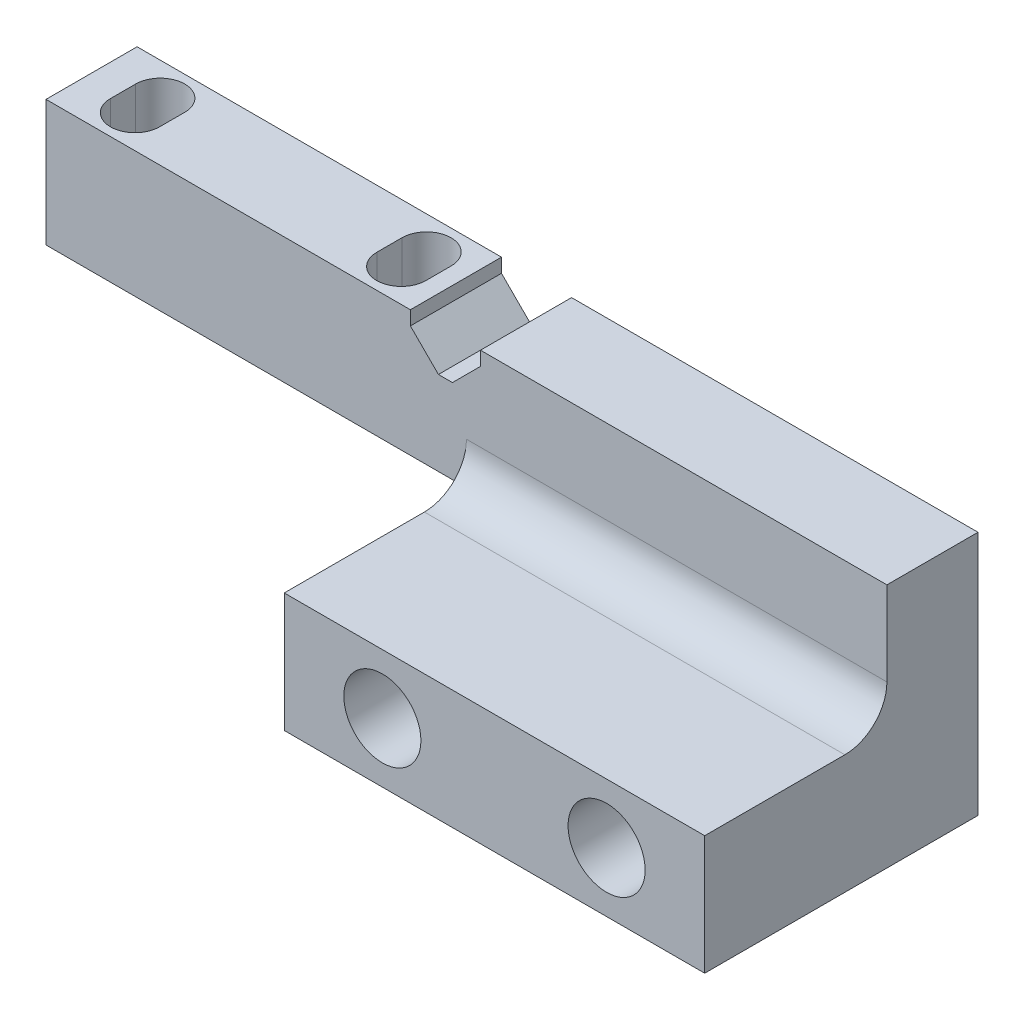
ISO-10303-21;
HEADER;
FILE_DESCRIPTION(('STEP AP214'),'2;1');
FILE_NAME('part.step','',(''),(''),'','','');
FILE_SCHEMA(('AUTOMOTIVE_DESIGN { 1 0 10303 214 1 1 1 1 }'));
ENDSEC;
DATA;
#1=APPLICATION_CONTEXT('core data for automotive mechanical design processes');
#2=APPLICATION_PROTOCOL_DEFINITION('international standard','automotive_design',2000,#1);
#3=PRODUCT_CONTEXT('',#1,'mechanical');
#4=PRODUCT('Part','Part','',(#3));
#5=PRODUCT_RELATED_PRODUCT_CATEGORY('part','',(#4));
#6=PRODUCT_DEFINITION_FORMATION('','',#4);
#7=PRODUCT_DEFINITION_CONTEXT('part definition',#1,'design');
#8=PRODUCT_DEFINITION('design','',#6,#7);
#9=PRODUCT_DEFINITION_SHAPE('','',#8);
#10=(LENGTH_UNIT() NAMED_UNIT(*) SI_UNIT(.MILLI.,.METRE.));
#11=(NAMED_UNIT(*) PLANE_ANGLE_UNIT() SI_UNIT($,.RADIAN.));
#12=(NAMED_UNIT(*) SI_UNIT($,.STERADIAN.) SOLID_ANGLE_UNIT());
#13=UNCERTAINTY_MEASURE_WITH_UNIT(LENGTH_MEASURE(1.E-05),#10,'distance_accuracy_value','');
#14=(GEOMETRIC_REPRESENTATION_CONTEXT(3) GLOBAL_UNCERTAINTY_ASSIGNED_CONTEXT((#13)) GLOBAL_UNIT_ASSIGNED_CONTEXT((#10,
#11,#12)) REPRESENTATION_CONTEXT('',''));
#15=CARTESIAN_POINT('',(0.,0.,0.));
#16=DIRECTION('',(0.,0.,1.));
#17=DIRECTION('',(1.,0.,0.));
#18=AXIS2_PLACEMENT_3D('',#15,#16,#17);
#19=CARTESIAN_POINT('',(-50.,13.25,0.));
#20=DIRECTION('',(0.,1.,0.));
#21=DIRECTION('',(1.,0.,0.));
#22=AXIS2_PLACEMENT_3D('',#19,#20,#21);
#23=PLANE('',#22);
#24=DIRECTION('',(0.,0.,-1.));
#25=VECTOR('',#24,1.);
#26=CARTESIAN_POINT('',(-69.,13.25,0.));
#27=LINE('',#26,#25);
#28=CARTESIAN_POINT('',(-69.,13.25,6.5));
#29=VERTEX_POINT('',#28);
#30=CARTESIAN_POINT('',(-69.,13.25,0.));
#31=VERTEX_POINT('',#30);
#32=EDGE_CURVE('E192',#29,#31,#27,.T.);
#33=ORIENTED_EDGE('',*,*,#32,.T.);
#34=DIRECTION('',(1.,0.,0.));
#35=VECTOR('',#34,1.);
#36=CARTESIAN_POINT('',(-5.,13.25,0.));
#37=LINE('',#36,#35);
#38=CARTESIAN_POINT('',(-95.,13.25,0.));
#39=VERTEX_POINT('',#38);
#40=EDGE_CURVE('E201',#39,#31,#37,.T.);
#41=ORIENTED_EDGE('',*,*,#40,.F.);
#42=DIRECTION('',(0.,0.,1.));
#43=VECTOR('',#42,1.);
#44=CARTESIAN_POINT('',(-95.,13.25,0.));
#45=LINE('',#44,#43);
#46=CARTESIAN_POINT('',(-95.,13.25,6.5));
#47=VERTEX_POINT('',#46);
#48=EDGE_CURVE('E276',#39,#47,#45,.T.);
#49=ORIENTED_EDGE('',*,*,#48,.T.);
#50=DIRECTION('',(-1.,0.,0.));
#51=VECTOR('',#50,1.);
#52=CARTESIAN_POINT('',(-5.,13.25,6.5));
#53=LINE('',#52,#51);
#54=EDGE_CURVE('E216',#29,#47,#53,.T.);
#55=ORIENTED_EDGE('',*,*,#54,.F.);
#56=EDGE_LOOP('',(#33,#41,#49,#55));
#57=FACE_BOUND('',#56,.T.);
#58=CARTESIAN_POINT('',(-72.,13.25,2.35));
#59=DIRECTION('',(0.,-1.,0.));
#60=DIRECTION('',(1.,0.,0.));
#61=AXIS2_PLACEMENT_3D('',#58,#59,#60);
#62=CIRCLE('',#61,1.75);
#63=CARTESIAN_POINT('',(-73.75,13.25,2.35));
#64=VERTEX_POINT('',#63);
#65=CARTESIAN_POINT('',(-70.25,13.25,2.35));
#66=VERTEX_POINT('',#65);
#67=EDGE_CURVE('E235',#64,#66,#62,.T.);
#68=ORIENTED_EDGE('',*,*,#67,.T.);
#69=DIRECTION('',(0.,0.,1.));
#70=VECTOR('',#69,1.);
#71=CARTESIAN_POINT('',(-70.25,13.25,2.35));
#72=LINE('',#71,#70);
#73=CARTESIAN_POINT('',(-70.25,13.25,4.15));
#74=VERTEX_POINT('',#73);
#75=EDGE_CURVE('E238',#66,#74,#72,.T.);
#76=ORIENTED_EDGE('',*,*,#75,.T.);
#77=CARTESIAN_POINT('',(-72.,13.25,4.15));
#78=DIRECTION('',(0.,-1.,0.));
#79=DIRECTION('',(1.,0.,0.));
#80=AXIS2_PLACEMENT_3D('',#77,#78,#79);
#81=CIRCLE('',#80,1.75);
#82=CARTESIAN_POINT('',(-73.75,13.25,4.15));
#83=VERTEX_POINT('',#82);
#84=EDGE_CURVE('E241',#74,#83,#81,.T.);
#85=ORIENTED_EDGE('',*,*,#84,.T.);
#86=DIRECTION('',(0.,0.,-1.));
#87=VECTOR('',#86,1.);
#88=CARTESIAN_POINT('',(-73.75,13.25,2.35));
#89=LINE('',#88,#87);
#90=EDGE_CURVE('E244',#83,#64,#89,.T.);
#91=ORIENTED_EDGE('',*,*,#90,.T.);
#92=EDGE_LOOP('',(#68,#76,#85,#91));
#93=FACE_BOUND('',#92,.T.);
#94=DIRECTION('',(0.,0.,-1.));
#95=VECTOR('',#94,1.);
#96=CARTESIAN_POINT('',(-89.25,13.25,2.35));
#97=LINE('',#96,#95);
#98=CARTESIAN_POINT('',(-89.25,13.25,4.15));
#99=VERTEX_POINT('',#98);
#100=CARTESIAN_POINT('',(-89.25,13.25,2.35));
#101=VERTEX_POINT('',#100);
#102=EDGE_CURVE('E258',#99,#101,#97,.T.);
#103=ORIENTED_EDGE('',*,*,#102,.F.);
#104=CARTESIAN_POINT('',(-91.,13.25,4.15));
#105=DIRECTION('',(0.,1.,0.));
#106=DIRECTION('',(-1.,0.,0.));
#107=AXIS2_PLACEMENT_3D('',#104,#105,#106);
#108=CIRCLE('',#107,1.75);
#109=CARTESIAN_POINT('',(-92.75,13.25,4.15));
#110=VERTEX_POINT('',#109);
#111=EDGE_CURVE('E261',#110,#99,#108,.T.);
#112=ORIENTED_EDGE('',*,*,#111,.F.);
#113=DIRECTION('',(0.,0.,1.));
#114=VECTOR('',#113,1.);
#115=CARTESIAN_POINT('',(-92.75,13.25,2.35));
#116=LINE('',#115,#114);
#117=CARTESIAN_POINT('',(-92.75,13.25,2.35));
#118=VERTEX_POINT('',#117);
#119=EDGE_CURVE('E264',#118,#110,#116,.T.);
#120=ORIENTED_EDGE('',*,*,#119,.F.);
#121=CARTESIAN_POINT('',(-91.,13.25,2.35));
#122=DIRECTION('',(0.,1.,0.));
#123=DIRECTION('',(-1.,0.,0.));
#124=AXIS2_PLACEMENT_3D('',#121,#122,#123);
#125=CIRCLE('',#124,1.75);
#126=EDGE_CURVE('E250',#101,#118,#125,.T.);
#127=ORIENTED_EDGE('',*,*,#126,.F.);
#128=EDGE_LOOP('',(#103,#112,#120,#127));
#129=FACE_BOUND('',#128,.T.);
#130=ADVANCED_FACE('F35',(#57,#93,#129),#23,.T.);
#131=DIRECTION('',(0.,0.,1.));
#132=VECTOR('',#131,1.);
#133=CARTESIAN_POINT('',(-64.,13.25,0.));
#134=LINE('',#133,#132);
#135=CARTESIAN_POINT('',(-64.,13.25,0.));
#136=VERTEX_POINT('',#135);
#137=CARTESIAN_POINT('',(-64.,13.25,6.5));
#138=VERTEX_POINT('',#137);
#139=EDGE_CURVE('E217',#136,#138,#134,.T.);
#140=ORIENTED_EDGE('',*,*,#139,.T.);
#141=CARTESIAN_POINT('',(-35.,13.25,6.5));
#142=VERTEX_POINT('',#141);
#143=EDGE_CURVE('E308',#142,#138,#53,.T.);
#144=ORIENTED_EDGE('',*,*,#143,.F.);
#145=DIRECTION('',(0.,0.,1.));
#146=VECTOR('',#145,1.);
#147=CARTESIAN_POINT('',(-35.,13.25,-3.5));
#148=LINE('',#147,#146);
#149=CARTESIAN_POINT('',(-35.,13.25,0.));
#150=VERTEX_POINT('',#149);
#151=EDGE_CURVE('E232',#150,#142,#148,.T.);
#152=ORIENTED_EDGE('',*,*,#151,.F.);
#153=EDGE_CURVE('E211',#136,#150,#37,.T.);
#154=ORIENTED_EDGE('',*,*,#153,.F.);
#155=EDGE_LOOP('',(#140,#144,#152,#154));
#156=FACE_BOUND('',#155,.T.);
#157=ADVANCED_FACE('F394',(#156),#23,.T.);
#158=CARTESIAN_POINT('',(-50.,4.25000000000001,0.));
#159=DIRECTION('',(0.,1.,0.));
#160=DIRECTION('',(-1.,0.,0.));
#161=AXIS2_PLACEMENT_3D('',#158,#159,#160);
#162=PLANE('',#161);
#163=DIRECTION('',(0.,0.,-1.));
#164=VECTOR('',#163,1.);
#165=CARTESIAN_POINT('',(-73.75,4.25000000000002,0.));
#166=LINE('',#165,#164);
#167=CARTESIAN_POINT('',(-73.75,4.25000000000002,4.15));
#168=VERTEX_POINT('',#167);
#169=CARTESIAN_POINT('',(-73.75,4.25000000000002,2.35));
#170=VERTEX_POINT('',#169);
#171=EDGE_CURVE('E366',#168,#170,#166,.T.);
#172=ORIENTED_EDGE('',*,*,#171,.F.);
#173=CARTESIAN_POINT('',(-72.,4.25000000000002,4.15));
#174=DIRECTION('',(0.,-1.,0.));
#175=DIRECTION('',(1.,0.,0.));
#176=AXIS2_PLACEMENT_3D('',#173,#174,#175);
#177=CIRCLE('',#176,1.75);
#178=CARTESIAN_POINT('',(-70.25,4.25000000000002,4.15));
#179=VERTEX_POINT('',#178);
#180=EDGE_CURVE('E363',#179,#168,#177,.T.);
#181=ORIENTED_EDGE('',*,*,#180,.F.);
#182=DIRECTION('',(0.,0.,1.));
#183=VECTOR('',#182,1.);
#184=CARTESIAN_POINT('',(-70.25,4.25000000000002,0.));
#185=LINE('',#184,#183);
#186=CARTESIAN_POINT('',(-70.25,4.25000000000002,2.35));
#187=VERTEX_POINT('',#186);
#188=EDGE_CURVE('E360',#187,#179,#185,.T.);
#189=ORIENTED_EDGE('',*,*,#188,.F.);
#190=CARTESIAN_POINT('',(-72.,4.25000000000002,2.35));
#191=DIRECTION('',(0.,-1.,0.));
#192=DIRECTION('',(1.,0.,0.));
#193=AXIS2_PLACEMENT_3D('',#190,#191,#192);
#194=CIRCLE('',#193,1.75);
#195=EDGE_CURVE('E369',#170,#187,#194,.T.);
#196=ORIENTED_EDGE('',*,*,#195,.F.);
#197=EDGE_LOOP('',(#172,#181,#189,#196));
#198=FACE_BOUND('',#197,.T.);
#199=DIRECTION('',(1.,0.,0.));
#200=VECTOR('',#199,1.);
#201=CARTESIAN_POINT('',(-95.,4.25000000000003,6.5));
#202=LINE('',#201,#200);
#203=CARTESIAN_POINT('',(-95.,4.25000000000003,6.5));
#204=VERTEX_POINT('',#203);
#205=CARTESIAN_POINT('',(-65.,4.25000000000002,6.5));
#206=VERTEX_POINT('',#205);
#207=EDGE_CURVE('E279',#204,#206,#202,.T.);
#208=ORIENTED_EDGE('',*,*,#207,.F.);
#209=DIRECTION('',(0.,0.,1.));
#210=VECTOR('',#209,1.);
#211=CARTESIAN_POINT('',(-95.,4.25000000000003,0.));
#212=LINE('',#211,#210);
#213=CARTESIAN_POINT('',(-95.,4.25000000000003,0.));
#214=VERTEX_POINT('',#213);
#215=EDGE_CURVE('E270',#214,#204,#212,.T.);
#216=ORIENTED_EDGE('',*,*,#215,.F.);
#217=DIRECTION('',(-1.,0.,0.));
#218=VECTOR('',#217,1.);
#219=CARTESIAN_POINT('',(-95.,4.25000000000003,0.));
#220=LINE('',#219,#218);
#221=CARTESIAN_POINT('',(-65.,4.25000000000002,0.));
#222=VERTEX_POINT('',#221);
#223=EDGE_CURVE('E282',#222,#214,#220,.T.);
#224=ORIENTED_EDGE('',*,*,#223,.F.);
#225=DIRECTION('',(0.,0.,-1.));
#226=VECTOR('',#225,1.);
#227=CARTESIAN_POINT('',(-65.,4.25000000000002,25.));
#228=LINE('',#227,#226);
#229=EDGE_CURVE('E291',#206,#222,#228,.T.);
#230=ORIENTED_EDGE('',*,*,#229,.F.);
#231=EDGE_LOOP('',(#208,#216,#224,#230));
#232=FACE_BOUND('',#231,.T.);
#233=CARTESIAN_POINT('',(-91.,4.25000000000003,2.35));
#234=DIRECTION('',(0.,-1.,0.));
#235=DIRECTION('',(1.,0.,0.));
#236=AXIS2_PLACEMENT_3D('',#233,#234,#235);
#237=CIRCLE('',#236,1.75);
#238=CARTESIAN_POINT('',(-89.25,4.25000000000003,2.35));
#239=VERTEX_POINT('',#238);
#240=CARTESIAN_POINT('',(-92.75,4.25000000000003,2.35));
#241=VERTEX_POINT('',#240);
#242=EDGE_CURVE('E357',#239,#241,#237,.F.);
#243=ORIENTED_EDGE('',*,*,#242,.T.);
#244=DIRECTION('',(0.,0.,1.));
#245=VECTOR('',#244,1.);
#246=CARTESIAN_POINT('',(-92.75,4.25000000000003,0.));
#247=LINE('',#246,#245);
#248=CARTESIAN_POINT('',(-92.75,4.25000000000003,4.15));
#249=VERTEX_POINT('',#248);
#250=EDGE_CURVE('E354',#241,#249,#247,.T.);
#251=ORIENTED_EDGE('',*,*,#250,.T.);
#252=CARTESIAN_POINT('',(-91.,4.25000000000003,4.15));
#253=DIRECTION('',(0.,-1.,0.));
#254=DIRECTION('',(1.,0.,0.));
#255=AXIS2_PLACEMENT_3D('',#252,#253,#254);
#256=CIRCLE('',#255,1.75);
#257=CARTESIAN_POINT('',(-89.25,4.25000000000003,4.15));
#258=VERTEX_POINT('',#257);
#259=EDGE_CURVE('E351',#249,#258,#256,.F.);
#260=ORIENTED_EDGE('',*,*,#259,.T.);
#261=DIRECTION('',(0.,0.,-1.));
#262=VECTOR('',#261,1.);
#263=CARTESIAN_POINT('',(-89.25,4.25000000000003,0.));
#264=LINE('',#263,#262);
#265=EDGE_CURVE('E346',#258,#239,#264,.T.);
#266=ORIENTED_EDGE('',*,*,#265,.T.);
#267=EDGE_LOOP('',(#243,#251,#260,#266));
#268=FACE_BOUND('',#267,.T.);
#269=ADVANCED_FACE('F410',(#198,#232,#268),#162,.F.);
#270=CARTESIAN_POINT('',(-65.,4.25000000000002,25.));
#271=DIRECTION('',(0.,-1.,0.));
#272=DIRECTION('',(-1.,0.,0.));
#273=AXIS2_PLACEMENT_3D('',#270,#271,#272);
#274=PLANE('',#273);
#275=DIRECTION('',(0.,0.,-1.));
#276=VECTOR('',#275,1.);
#277=CARTESIAN_POINT('',(-35.,4.25,25.));
#278=LINE('',#277,#276);
#279=CARTESIAN_POINT('',(-35.,4.25000000000001,19.5));
#280=VERTEX_POINT('',#279);
#281=CARTESIAN_POINT('',(-35.,4.25,9.5));
#282=VERTEX_POINT('',#281);
#283=EDGE_CURVE('E324',#280,#282,#278,.T.);
#284=ORIENTED_EDGE('',*,*,#283,.T.);
#285=DIRECTION('',(-1.,0.,0.));
#286=VECTOR('',#285,1.);
#287=CARTESIAN_POINT('',(-35.,4.25,9.5));
#288=LINE('',#287,#286);
#289=CARTESIAN_POINT('',(-65.,4.25000000000002,9.5));
#290=VERTEX_POINT('',#289);
#291=EDGE_CURVE('E338',#290,#282,#288,.F.);
#292=ORIENTED_EDGE('',*,*,#291,.F.);
#293=DIRECTION('',(0.,0.,-1.));
#294=VECTOR('',#293,1.);
#295=CARTESIAN_POINT('',(-65.,4.25000000000002,25.));
#296=LINE('',#295,#294);
#297=CARTESIAN_POINT('',(-65.,4.25000000000002,19.5));
#298=VERTEX_POINT('',#297);
#299=EDGE_CURVE('E327',#298,#290,#296,.T.);
#300=ORIENTED_EDGE('',*,*,#299,.F.);
#301=DIRECTION('',(-1.,0.,0.));
#302=VECTOR('',#301,1.);
#303=CARTESIAN_POINT('',(-5.00000000000001,4.24999999999999,19.5));
#304=LINE('',#303,#302);
#305=EDGE_CURVE('E297',#280,#298,#304,.T.);
#306=ORIENTED_EDGE('',*,*,#305,.F.);
#307=EDGE_LOOP('',(#284,#292,#300,#306));
#308=FACE_BOUND('',#307,.T.);
#309=ADVANCED_FACE('F432',(#308),#274,.F.);
#310=CARTESIAN_POINT('',(-35.,-4.25,25.));
#311=DIRECTION('',(-1.,0.,0.));
#312=DIRECTION('',(0.,1.,0.));
#313=AXIS2_PLACEMENT_3D('',#310,#311,#312);
#314=PLANE('',#313);
#315=ORIENTED_EDGE('',*,*,#151,.T.);
#316=DIRECTION('',(0.,1.,0.));
#317=VECTOR('',#316,1.);
#318=CARTESIAN_POINT('',(-35.,4.25000000000001,6.5));
#319=LINE('',#318,#317);
#320=CARTESIAN_POINT('',(-35.,7.25,6.5));
#321=VERTEX_POINT('',#320);
#322=EDGE_CURVE('E227',#321,#142,#319,.T.);
#323=ORIENTED_EDGE('',*,*,#322,.F.);
#324=CARTESIAN_POINT('',(-35.,7.25,9.5));
#325=DIRECTION('',(1.,0.,0.));
#326=DIRECTION('',(0.,1.,0.));
#327=AXIS2_PLACEMENT_3D('',#324,#325,#326);
#328=CIRCLE('',#327,3.);
#329=EDGE_CURVE('E343',#282,#321,#328,.T.);
#330=ORIENTED_EDGE('',*,*,#329,.F.);
#331=ORIENTED_EDGE('',*,*,#283,.F.);
#332=DIRECTION('',(0.,1.,0.));
#333=VECTOR('',#332,1.);
#334=CARTESIAN_POINT('',(-35.,-4.25,19.5));
#335=LINE('',#334,#333);
#336=CARTESIAN_POINT('',(-35.,-4.24999999999999,19.5));
#337=VERTEX_POINT('',#336);
#338=EDGE_CURVE('E306',#337,#280,#335,.T.);
#339=ORIENTED_EDGE('',*,*,#338,.F.);
#340=DIRECTION('',(0.,0.,-1.));
#341=VECTOR('',#340,1.);
#342=CARTESIAN_POINT('',(-35.,-4.25,25.));
#343=LINE('',#342,#341);
#344=CARTESIAN_POINT('',(-35.,-4.25,0.));
#345=VERTEX_POINT('',#344);
#346=EDGE_CURVE('E333',#337,#345,#343,.T.);
#347=ORIENTED_EDGE('',*,*,#346,.T.);
#348=DIRECTION('',(0.,-1.,0.));
#349=VECTOR('',#348,1.);
#350=CARTESIAN_POINT('',(-35.,-4.25,0.));
#351=LINE('',#350,#349);
#352=EDGE_CURVE('E316',#150,#345,#351,.T.);
#353=ORIENTED_EDGE('',*,*,#352,.F.);
#354=EDGE_LOOP('',(#315,#323,#330,#331,#339,#347,#353));
#355=FACE_BOUND('',#354,.T.);
#356=ADVANCED_FACE('F422',(#355),#314,.F.);
#357=CARTESIAN_POINT('',(-65.,-4.24999999999998,25.));
#358=DIRECTION('',(0.,1.,0.));
#359=DIRECTION('',(1.,0.,0.));
#360=AXIS2_PLACEMENT_3D('',#357,#358,#359);
#361=PLANE('',#360);
#362=DIRECTION('',(0.,0.,-1.));
#363=VECTOR('',#362,1.);
#364=CARTESIAN_POINT('',(-65.,-4.24999999999998,25.));
#365=LINE('',#364,#363);
#366=CARTESIAN_POINT('',(-65.,-4.24999999999998,19.5));
#367=VERTEX_POINT('',#366);
#368=CARTESIAN_POINT('',(-65.,-4.24999999999998,0.));
#369=VERTEX_POINT('',#368);
#370=EDGE_CURVE('E330',#367,#369,#365,.T.);
#371=ORIENTED_EDGE('',*,*,#370,.T.);
#372=DIRECTION('',(-1.,0.,0.));
#373=VECTOR('',#372,1.);
#374=CARTESIAN_POINT('',(-65.,-4.24999999999998,0.));
#375=LINE('',#374,#373);
#376=EDGE_CURVE('E319',#345,#369,#375,.T.);
#377=ORIENTED_EDGE('',*,*,#376,.F.);
#378=ORIENTED_EDGE('',*,*,#346,.F.);
#379=DIRECTION('',(-1.,0.,0.));
#380=VECTOR('',#379,1.);
#381=CARTESIAN_POINT('',(-5.00000000000001,-4.25000000000001,19.5));
#382=LINE('',#381,#380);
#383=EDGE_CURVE('E296',#337,#367,#382,.T.);
#384=ORIENTED_EDGE('',*,*,#383,.T.);
#385=EDGE_LOOP('',(#371,#377,#378,#384));
#386=FACE_BOUND('',#385,.T.);
#387=ADVANCED_FACE('F426',(#386),#361,.F.);
#388=CARTESIAN_POINT('',(-65.,-4.24999999999998,25.));
#389=DIRECTION('',(1.,0.,0.));
#390=DIRECTION('',(0.,0.,1.));
#391=AXIS2_PLACEMENT_3D('',#388,#389,#390);
#392=PLANE('',#391);
#393=ORIENTED_EDGE('',*,*,#229,.T.);
#394=DIRECTION('',(0.,1.,0.));
#395=VECTOR('',#394,1.);
#396=CARTESIAN_POINT('',(-65.,-4.24999999999998,0.));
#397=LINE('',#396,#395);
#398=EDGE_CURVE('E322',#369,#222,#397,.T.);
#399=ORIENTED_EDGE('',*,*,#398,.F.);
#400=ORIENTED_EDGE('',*,*,#370,.F.);
#401=DIRECTION('',(0.,1.,0.));
#402=VECTOR('',#401,1.);
#403=CARTESIAN_POINT('',(-65.,4.25000000000002,19.5));
#404=LINE('',#403,#402);
#405=EDGE_CURVE('E294',#367,#298,#404,.T.);
#406=ORIENTED_EDGE('',*,*,#405,.T.);
#407=ORIENTED_EDGE('',*,*,#299,.T.);
#408=CARTESIAN_POINT('',(-65.,7.25000000000002,9.5));
#409=DIRECTION('',(-1.,0.,0.));
#410=DIRECTION('',(0.,0.,1.));
#411=AXIS2_PLACEMENT_3D('',#408,#409,#410);
#412=CIRCLE('',#411,3.);
#413=CARTESIAN_POINT('',(-65.,7.25000000000002,6.5));
#414=VERTEX_POINT('',#413);
#415=EDGE_CURVE('E341',#414,#290,#412,.T.);
#416=ORIENTED_EDGE('',*,*,#415,.F.);
#417=DIRECTION('',(0.,1.,0.));
#418=VECTOR('',#417,1.);
#419=CARTESIAN_POINT('',(-65.,-4.24999999999998,6.5));
#420=LINE('',#419,#418);
#421=EDGE_CURVE('E288',#206,#414,#420,.T.);
#422=ORIENTED_EDGE('',*,*,#421,.F.);
#423=EDGE_LOOP('',(#393,#399,#400,#406,#407,#416,#422));
#424=FACE_BOUND('',#423,.T.);
#425=ADVANCED_FACE('F414',(#424),#392,.F.);
#426=CARTESIAN_POINT('',(-50.,0.,0.));
#427=DIRECTION('',(0.,0.,1.));
#428=DIRECTION('',(-1.,0.,0.));
#429=AXIS2_PLACEMENT_3D('',#426,#427,#428);
#430=PLANE('',#429);
#431=DIRECTION('',(1.,0.,0.));
#432=VECTOR('',#431,1.);
#433=CARTESIAN_POINT('',(-69.,10.25,0.));
#434=LINE('',#433,#432);
#435=CARTESIAN_POINT('',(-67.,10.25,0.));
#436=VERTEX_POINT('',#435);
#437=CARTESIAN_POINT('',(-66.,10.25,0.));
#438=VERTEX_POINT('',#437);
#439=EDGE_CURVE('E220',#436,#438,#434,.T.);
#440=ORIENTED_EDGE('',*,*,#439,.T.);
#441=DIRECTION('',(0.707106781186552,0.707106781186543,0.));
#442=VECTOR('',#441,1.);
#443=CARTESIAN_POINT('',(-63.1249999999999,13.1250000000001,0.));
#444=LINE('',#443,#442);
#445=CARTESIAN_POINT('',(-64.,12.25,0.));
#446=VERTEX_POINT('',#445);
#447=EDGE_CURVE('E11',#446,#438,#444,.F.);
#448=ORIENTED_EDGE('',*,*,#447,.F.);
#449=DIRECTION('',(0.,1.,0.));
#450=VECTOR('',#449,1.);
#451=CARTESIAN_POINT('',(-64.,10.25,0.));
#452=LINE('',#451,#450);
#453=EDGE_CURVE('E197',#446,#136,#452,.T.);
#454=ORIENTED_EDGE('',*,*,#453,.T.);
#455=ORIENTED_EDGE('',*,*,#153,.T.);
#456=ORIENTED_EDGE('',*,*,#352,.T.);
#457=ORIENTED_EDGE('',*,*,#376,.T.);
#458=ORIENTED_EDGE('',*,*,#398,.T.);
#459=ORIENTED_EDGE('',*,*,#223,.T.);
#460=DIRECTION('',(0.,-1.,0.));
#461=VECTOR('',#460,1.);
#462=CARTESIAN_POINT('',(-95.,13.25,0.));
#463=LINE('',#462,#461);
#464=EDGE_CURVE('E206',#39,#214,#463,.T.);
#465=ORIENTED_EDGE('',*,*,#464,.F.);
#466=ORIENTED_EDGE('',*,*,#40,.T.);
#467=DIRECTION('',(0.,1.,0.));
#468=VECTOR('',#467,1.);
#469=CARTESIAN_POINT('',(-69.,10.25,0.));
#470=LINE('',#469,#468);
#471=CARTESIAN_POINT('',(-69.,12.25,0.));
#472=VERTEX_POINT('',#471);
#473=EDGE_CURVE('E187',#472,#31,#470,.T.);
#474=ORIENTED_EDGE('',*,*,#473,.F.);
#475=DIRECTION('',(0.707106781186551,-0.707106781186544,0.));
#476=VECTOR('',#475,1.);
#477=CARTESIAN_POINT('',(-53.3749999999999,-3.37499999999993,0.));
#478=LINE('',#477,#476);
#479=EDGE_CURVE('E378',#436,#472,#478,.F.);
#480=ORIENTED_EDGE('',*,*,#479,.F.);
#481=EDGE_LOOP('',(#440,#448,#454,#455,#456,#457,#458,#459,#465,#466,#474,#480));
#482=FACE_BOUND('',#481,.T.);
#483=CARTESIAN_POINT('',(-58.,0.,0.));
#484=DIRECTION('',(0.,0.,-1.));
#485=DIRECTION('',(-1.,0.,0.));
#486=AXIS2_PLACEMENT_3D('',#483,#484,#485);
#487=CIRCLE('',#486,2.75);
#488=CARTESIAN_POINT('',(-60.75,0.,0.));
#489=VERTEX_POINT('',#488);
#490=EDGE_CURVE('E313',#489,#489,#487,.T.);
#491=ORIENTED_EDGE('',*,*,#490,.F.);
#492=EDGE_LOOP('',(#491));
#493=FACE_BOUND('',#492,.T.);
#494=CARTESIAN_POINT('',(-42.,0.,0.));
#495=DIRECTION('',(0.,0.,-1.));
#496=DIRECTION('',(-1.,0.,0.));
#497=AXIS2_PLACEMENT_3D('',#494,#495,#496);
#498=CIRCLE('',#497,2.75);
#499=CARTESIAN_POINT('',(-44.75,0.,0.));
#500=VERTEX_POINT('',#499);
#501=EDGE_CURVE('E210',#500,#500,#498,.T.);
#502=ORIENTED_EDGE('',*,*,#501,.F.);
#503=EDGE_LOOP('',(#502));
#504=FACE_BOUND('',#503,.T.);
#505=ADVANCED_FACE('F203',(#482,#493,#504),#430,.F.);
#506=CARTESIAN_POINT('',(-58.,0.,25.));
#507=DIRECTION('',(0.,0.,1.));
#508=DIRECTION('',(-1.,0.,0.));
#509=AXIS2_PLACEMENT_3D('',#506,#507,#508);
#510=CYLINDRICAL_SURFACE('',#509,2.74999999999999);
#511=CARTESIAN_POINT('',(-58.,0.,19.5));
#512=DIRECTION('',(0.,0.,1.));
#513=DIRECTION('',(1.,0.,0.));
#514=AXIS2_PLACEMENT_3D('',#511,#512,#513);
#515=CIRCLE('',#514,2.74999999999999);
#516=CARTESIAN_POINT('',(-55.25,0.,19.5));
#517=VERTEX_POINT('',#516);
#518=EDGE_CURVE('E303',#517,#517,#515,.F.);
#519=ORIENTED_EDGE('',*,*,#518,.F.);
#520=EDGE_LOOP('',(#519));
#521=FACE_BOUND('',#520,.T.);
#522=ORIENTED_EDGE('',*,*,#490,.T.);
#523=EDGE_LOOP('',(#522));
#524=FACE_BOUND('',#523,.T.);
#525=ADVANCED_FACE('F457',(#521,#524),#510,.F.);
#526=CARTESIAN_POINT('',(-42.,0.,25.));
#527=DIRECTION('',(0.,0.,1.));
#528=DIRECTION('',(-1.,0.,0.));
#529=AXIS2_PLACEMENT_3D('',#526,#527,#528);
#530=CYLINDRICAL_SURFACE('',#529,2.74999999999999);
#531=CARTESIAN_POINT('',(-42.,0.,19.5));
#532=DIRECTION('',(0.,0.,1.));
#533=DIRECTION('',(1.,0.,0.));
#534=AXIS2_PLACEMENT_3D('',#531,#532,#533);
#535=CIRCLE('',#534,2.74999999999999);
#536=CARTESIAN_POINT('',(-39.25,0.,19.5));
#537=VERTEX_POINT('',#536);
#538=EDGE_CURVE('E300',#537,#537,#535,.F.);
#539=ORIENTED_EDGE('',*,*,#538,.F.);
#540=EDGE_LOOP('',(#539));
#541=FACE_BOUND('',#540,.T.);
#542=ORIENTED_EDGE('',*,*,#501,.T.);
#543=EDGE_LOOP('',(#542));
#544=FACE_BOUND('',#543,.T.);
#545=ADVANCED_FACE('F454',(#541,#544),#530,.F.);
#546=CARTESIAN_POINT('',(-5.,13.25,6.5));
#547=DIRECTION('',(0.,0.,-1.));
#548=DIRECTION('',(1.,0.,0.));
#549=AXIS2_PLACEMENT_3D('',#546,#547,#548);
#550=PLANE('',#549);
#551=ORIENTED_EDGE('',*,*,#54,.T.);
#552=DIRECTION('',(0.,-1.,0.));
#553=VECTOR('',#552,1.);
#554=CARTESIAN_POINT('',(-95.,13.25,6.5));
#555=LINE('',#554,#553);
#556=EDGE_CURVE('E278',#47,#204,#555,.T.);
#557=ORIENTED_EDGE('',*,*,#556,.T.);
#558=ORIENTED_EDGE('',*,*,#207,.T.);
#559=ORIENTED_EDGE('',*,*,#421,.T.);
#560=DIRECTION('',(-1.,0.,0.));
#561=VECTOR('',#560,1.);
#562=CARTESIAN_POINT('',(-65.,7.25000000000002,6.5));
#563=LINE('',#562,#561);
#564=EDGE_CURVE('E336',#321,#414,#563,.T.);
#565=ORIENTED_EDGE('',*,*,#564,.F.);
#566=ORIENTED_EDGE('',*,*,#322,.T.);
#567=ORIENTED_EDGE('',*,*,#143,.T.);
#568=DIRECTION('',(0.,1.,0.));
#569=VECTOR('',#568,1.);
#570=CARTESIAN_POINT('',(-64.,10.25,6.5));
#571=LINE('',#570,#569);
#572=CARTESIAN_POINT('',(-64.,12.25,6.5));
#573=VERTEX_POINT('',#572);
#574=EDGE_CURVE('E228',#573,#138,#571,.T.);
#575=ORIENTED_EDGE('',*,*,#574,.F.);
#576=DIRECTION('',(-0.707106781186552,-0.707106781186543,0.));
#577=VECTOR('',#576,1.);
#578=CARTESIAN_POINT('',(-33.9999999999997,42.25,6.5));
#579=LINE('',#578,#577);
#580=CARTESIAN_POINT('',(-66.,10.25,6.5));
#581=VERTEX_POINT('',#580);
#582=EDGE_CURVE('E43',#581,#573,#579,.F.);
#583=ORIENTED_EDGE('',*,*,#582,.F.);
#584=DIRECTION('',(-1.,0.,0.));
#585=VECTOR('',#584,1.);
#586=CARTESIAN_POINT('',(-69.,10.25,6.5));
#587=LINE('',#586,#585);
#588=CARTESIAN_POINT('',(-67.,10.25,6.5));
#589=VERTEX_POINT('',#588);
#590=EDGE_CURVE('E198',#581,#589,#587,.T.);
#591=ORIENTED_EDGE('',*,*,#590,.T.);
#592=DIRECTION('',(-0.707106781186551,0.707106781186544,0.));
#593=VECTOR('',#592,1.);
#594=CARTESIAN_POINT('',(-37.4999999999997,-19.25,6.5));
#595=LINE('',#594,#593);
#596=CARTESIAN_POINT('',(-69.,12.25,6.5));
#597=VERTEX_POINT('',#596);
#598=EDGE_CURVE('E380',#597,#589,#595,.F.);
#599=ORIENTED_EDGE('',*,*,#598,.F.);
#600=DIRECTION('',(0.,1.,0.));
#601=VECTOR('',#600,1.);
#602=CARTESIAN_POINT('',(-69.,10.25,6.5));
#603=LINE('',#602,#601);
#604=EDGE_CURVE('E225',#597,#29,#603,.T.);
#605=ORIENTED_EDGE('',*,*,#604,.T.);
#606=EDGE_LOOP('',(#551,#557,#558,#559,#565,#566,#567,#575,#583,#591,#599,#605));
#607=FACE_BOUND('',#606,.T.);
#608=ADVANCED_FACE('F387',(#607),#550,.F.);
#609=CARTESIAN_POINT('',(-5.00000000000001,7.24999999999999,9.5));
#610=DIRECTION('',(1.,0.,0.));
#611=DIRECTION('',(0.,-1.,0.));
#612=AXIS2_PLACEMENT_3D('',#609,#610,#611);
#613=CYLINDRICAL_SURFACE('',#612,3.);
#614=ORIENTED_EDGE('',*,*,#329,.T.);
#615=ORIENTED_EDGE('',*,*,#564,.T.);
#616=ORIENTED_EDGE('',*,*,#415,.T.);
#617=ORIENTED_EDGE('',*,*,#291,.T.);
#618=EDGE_LOOP('',(#614,#615,#616,#617));
#619=FACE_BOUND('',#618,.T.);
#620=ADVANCED_FACE('F418',(#619),#613,.F.);
#621=CARTESIAN_POINT('',(-5.00000000000001,4.24999999999999,19.5));
#622=DIRECTION('',(0.,0.,-1.));
#623=DIRECTION('',(1.,0.,0.));
#624=AXIS2_PLACEMENT_3D('',#621,#622,#623);
#625=PLANE('',#624);
#626=ORIENTED_EDGE('',*,*,#538,.T.);
#627=EDGE_LOOP('',(#626));
#628=FACE_BOUND('',#627,.T.);
#629=ORIENTED_EDGE('',*,*,#518,.T.);
#630=EDGE_LOOP('',(#629));
#631=FACE_BOUND('',#630,.T.);
#632=ORIENTED_EDGE('',*,*,#383,.F.);
#633=ORIENTED_EDGE('',*,*,#338,.T.);
#634=ORIENTED_EDGE('',*,*,#305,.T.);
#635=ORIENTED_EDGE('',*,*,#405,.F.);
#636=EDGE_LOOP('',(#632,#633,#634,#635));
#637=FACE_BOUND('',#636,.T.);
#638=ADVANCED_FACE('F430',(#628,#631,#637),#625,.F.);
#639=CARTESIAN_POINT('',(-95.,13.25,0.));
#640=DIRECTION('',(-1.,0.,0.));
#641=DIRECTION('',(0.,1.,0.));
#642=AXIS2_PLACEMENT_3D('',#639,#640,#641);
#643=PLANE('',#642);
#644=ORIENTED_EDGE('',*,*,#215,.T.);
#645=ORIENTED_EDGE('',*,*,#556,.F.);
#646=ORIENTED_EDGE('',*,*,#48,.F.);
#647=ORIENTED_EDGE('',*,*,#464,.T.);
#648=EDGE_LOOP('',(#644,#645,#646,#647));
#649=FACE_BOUND('',#648,.T.);
#650=ADVANCED_FACE('F404',(#649),#643,.T.);
#651=CARTESIAN_POINT('',(-91.,-4.24999999999998,2.35));
#652=DIRECTION('',(0.,1.,0.));
#653=DIRECTION('',(1.,0.,0.));
#654=AXIS2_PLACEMENT_3D('',#651,#652,#653);
#655=CYLINDRICAL_SURFACE('',#654,1.75);
#656=ORIENTED_EDGE('',*,*,#242,.F.);
#657=DIRECTION('',(0.,1.,0.));
#658=VECTOR('',#657,1.);
#659=CARTESIAN_POINT('',(-89.25,-4.24999999999998,2.35));
#660=LINE('',#659,#658);
#661=EDGE_CURVE('E267',#239,#101,#660,.T.);
#662=ORIENTED_EDGE('',*,*,#661,.T.);
#663=ORIENTED_EDGE('',*,*,#126,.T.);
#664=DIRECTION('',(0.,1.,0.));
#665=VECTOR('',#664,1.);
#666=CARTESIAN_POINT('',(-92.75,-4.24999999999998,2.35));
#667=LINE('',#666,#665);
#668=EDGE_CURVE('E268',#241,#118,#667,.T.);
#669=ORIENTED_EDGE('',*,*,#668,.F.);
#670=EDGE_LOOP('',(#656,#662,#663,#669));
#671=FACE_BOUND('',#670,.T.);
#672=ADVANCED_FACE('F505',(#671),#655,.F.);
#673=CARTESIAN_POINT('',(-92.75,-4.24999999999998,2.35));
#674=DIRECTION('',(1.,0.,0.));
#675=DIRECTION('',(0.,-1.,0.));
#676=AXIS2_PLACEMENT_3D('',#673,#674,#675);
#677=PLANE('',#676);
#678=ORIENTED_EDGE('',*,*,#250,.F.);
#679=ORIENTED_EDGE('',*,*,#668,.T.);
#680=ORIENTED_EDGE('',*,*,#119,.T.);
#681=DIRECTION('',(0.,1.,0.));
#682=VECTOR('',#681,1.);
#683=CARTESIAN_POINT('',(-92.75,-4.24999999999998,4.15));
#684=LINE('',#683,#682);
#685=EDGE_CURVE('E271',#249,#110,#684,.T.);
#686=ORIENTED_EDGE('',*,*,#685,.F.);
#687=EDGE_LOOP('',(#678,#679,#680,#686));
#688=FACE_BOUND('',#687,.T.);
#689=ADVANCED_FACE('F501',(#688),#677,.T.);
#690=CARTESIAN_POINT('',(-91.,-4.24999999999998,4.15));
#691=DIRECTION('',(0.,1.,0.));
#692=DIRECTION('',(1.,0.,0.));
#693=AXIS2_PLACEMENT_3D('',#690,#691,#692);
#694=CYLINDRICAL_SURFACE('',#693,1.75);
#695=ORIENTED_EDGE('',*,*,#259,.F.);
#696=ORIENTED_EDGE('',*,*,#685,.T.);
#697=ORIENTED_EDGE('',*,*,#111,.T.);
#698=DIRECTION('',(0.,1.,0.));
#699=VECTOR('',#698,1.);
#700=CARTESIAN_POINT('',(-89.25,-4.24999999999998,4.15));
#701=LINE('',#700,#699);
#702=EDGE_CURVE('E273',#258,#99,#701,.T.);
#703=ORIENTED_EDGE('',*,*,#702,.F.);
#704=EDGE_LOOP('',(#695,#696,#697,#703));
#705=FACE_BOUND('',#704,.T.);
#706=ADVANCED_FACE('F504',(#705),#694,.F.);
#707=CARTESIAN_POINT('',(-89.25,-4.24999999999998,2.35));
#708=DIRECTION('',(-1.,0.,0.));
#709=DIRECTION('',(0.,1.,0.));
#710=AXIS2_PLACEMENT_3D('',#707,#708,#709);
#711=PLANE('',#710);
#712=ORIENTED_EDGE('',*,*,#265,.F.);
#713=ORIENTED_EDGE('',*,*,#702,.T.);
#714=ORIENTED_EDGE('',*,*,#102,.T.);
#715=ORIENTED_EDGE('',*,*,#661,.F.);
#716=EDGE_LOOP('',(#712,#713,#714,#715));
#717=FACE_BOUND('',#716,.T.);
#718=ADVANCED_FACE('F499',(#717),#711,.T.);
#719=CARTESIAN_POINT('',(-72.,-4.24999999999999,2.35));
#720=DIRECTION('',(0.,1.,0.));
#721=DIRECTION('',(1.,0.,0.));
#722=AXIS2_PLACEMENT_3D('',#719,#720,#721);
#723=CYLINDRICAL_SURFACE('',#722,1.75);
#724=DIRECTION('',(0.,1.,0.));
#725=VECTOR('',#724,1.);
#726=CARTESIAN_POINT('',(-73.75,-4.24999999999999,2.35));
#727=LINE('',#726,#725);
#728=EDGE_CURVE('E248',#170,#64,#727,.T.);
#729=ORIENTED_EDGE('',*,*,#728,.F.);
#730=ORIENTED_EDGE('',*,*,#195,.T.);
#731=DIRECTION('',(0.,1.,0.));
#732=VECTOR('',#731,1.);
#733=CARTESIAN_POINT('',(-70.25,-4.24999999999999,2.35));
#734=LINE('',#733,#732);
#735=EDGE_CURVE('E247',#187,#66,#734,.T.);
#736=ORIENTED_EDGE('',*,*,#735,.T.);
#737=ORIENTED_EDGE('',*,*,#67,.F.);
#738=EDGE_LOOP('',(#729,#730,#736,#737));
#739=FACE_BOUND('',#738,.T.);
#740=ADVANCED_FACE('F489',(#739),#723,.F.);
#741=CARTESIAN_POINT('',(-73.75,-4.24999999999999,2.35));
#742=DIRECTION('',(-1.,0.,0.));
#743=DIRECTION('',(0.,1.,0.));
#744=AXIS2_PLACEMENT_3D('',#741,#742,#743);
#745=PLANE('',#744);
#746=DIRECTION('',(0.,1.,0.));
#747=VECTOR('',#746,1.);
#748=CARTESIAN_POINT('',(-73.75,-4.24999999999999,4.15));
#749=LINE('',#748,#747);
#750=EDGE_CURVE('E251',#168,#83,#749,.T.);
#751=ORIENTED_EDGE('',*,*,#750,.F.);
#752=ORIENTED_EDGE('',*,*,#171,.T.);
#753=ORIENTED_EDGE('',*,*,#728,.T.);
#754=ORIENTED_EDGE('',*,*,#90,.F.);
#755=EDGE_LOOP('',(#751,#752,#753,#754));
#756=FACE_BOUND('',#755,.T.);
#757=ADVANCED_FACE('F485',(#756),#745,.F.);
#758=CARTESIAN_POINT('',(-72.,-4.24999999999999,4.15));
#759=DIRECTION('',(0.,1.,0.));
#760=DIRECTION('',(1.,0.,0.));
#761=AXIS2_PLACEMENT_3D('',#758,#759,#760);
#762=CYLINDRICAL_SURFACE('',#761,1.75);
#763=DIRECTION('',(0.,1.,0.));
#764=VECTOR('',#763,1.);
#765=CARTESIAN_POINT('',(-70.25,-4.24999999999999,4.15));
#766=LINE('',#765,#764);
#767=EDGE_CURVE('E253',#179,#74,#766,.T.);
#768=ORIENTED_EDGE('',*,*,#767,.F.);
#769=ORIENTED_EDGE('',*,*,#180,.T.);
#770=ORIENTED_EDGE('',*,*,#750,.T.);
#771=ORIENTED_EDGE('',*,*,#84,.F.);
#772=EDGE_LOOP('',(#768,#769,#770,#771));
#773=FACE_BOUND('',#772,.T.);
#774=ADVANCED_FACE('F488',(#773),#762,.F.);
#775=CARTESIAN_POINT('',(-70.25,-4.24999999999999,2.35));
#776=DIRECTION('',(1.,0.,0.));
#777=DIRECTION('',(0.,-1.,0.));
#778=AXIS2_PLACEMENT_3D('',#775,#776,#777);
#779=PLANE('',#778);
#780=ORIENTED_EDGE('',*,*,#735,.F.);
#781=ORIENTED_EDGE('',*,*,#188,.T.);
#782=ORIENTED_EDGE('',*,*,#767,.T.);
#783=ORIENTED_EDGE('',*,*,#75,.F.);
#784=EDGE_LOOP('',(#780,#781,#782,#783));
#785=FACE_BOUND('',#784,.T.);
#786=ADVANCED_FACE('F484',(#785),#779,.F.);
#787=CARTESIAN_POINT('',(-69.,10.25,0.));
#788=DIRECTION('',(-1.,0.,0.));
#789=DIRECTION('',(0.,1.,0.));
#790=AXIS2_PLACEMENT_3D('',#787,#788,#789);
#791=PLANE('',#790);
#792=ORIENTED_EDGE('',*,*,#473,.T.);
#793=ORIENTED_EDGE('',*,*,#32,.F.);
#794=ORIENTED_EDGE('',*,*,#604,.F.);
#795=DIRECTION('',(0.,0.,1.));
#796=VECTOR('',#795,1.);
#797=CARTESIAN_POINT('',(-69.,12.25,6.5));
#798=LINE('',#797,#796);
#799=EDGE_CURVE('E193',#472,#597,#798,.T.);
#800=ORIENTED_EDGE('',*,*,#799,.F.);
#801=EDGE_LOOP('',(#792,#793,#794,#800));
#802=FACE_BOUND('',#801,.T.);
#803=ADVANCED_FACE('F189',(#802),#791,.F.);
#804=CARTESIAN_POINT('',(-64.,10.25,0.));
#805=DIRECTION('',(1.,0.,0.));
#806=DIRECTION('',(0.,0.,1.));
#807=AXIS2_PLACEMENT_3D('',#804,#805,#806);
#808=PLANE('',#807);
#809=ORIENTED_EDGE('',*,*,#574,.T.);
#810=ORIENTED_EDGE('',*,*,#139,.F.);
#811=ORIENTED_EDGE('',*,*,#453,.F.);
#812=DIRECTION('',(0.,0.,-1.));
#813=VECTOR('',#812,1.);
#814=CARTESIAN_POINT('',(-64.,12.25,0.));
#815=LINE('',#814,#813);
#816=EDGE_CURVE('E49',#573,#446,#815,.T.);
#817=ORIENTED_EDGE('',*,*,#816,.F.);
#818=EDGE_LOOP('',(#809,#810,#811,#817));
#819=FACE_BOUND('',#818,.T.);
#820=ADVANCED_FACE('F390',(#819),#808,.F.);
#821=CARTESIAN_POINT('',(-50.,10.25,0.));
#822=DIRECTION('',(0.,-1.,0.));
#823=DIRECTION('',(0.,0.,-1.));
#824=AXIS2_PLACEMENT_3D('',#821,#822,#823);
#825=PLANE('',#824);
#826=ORIENTED_EDGE('',*,*,#590,.F.);
#827=DIRECTION('',(0.,0.,1.));
#828=VECTOR('',#827,1.);
#829=CARTESIAN_POINT('',(-66.,10.25,6.5));
#830=LINE('',#829,#828);
#831=EDGE_CURVE('E372',#438,#581,#830,.T.);
#832=ORIENTED_EDGE('',*,*,#831,.F.);
#833=ORIENTED_EDGE('',*,*,#439,.F.);
#834=DIRECTION('',(0.,0.,-1.));
#835=VECTOR('',#834,1.);
#836=CARTESIAN_POINT('',(-67.,10.25,0.));
#837=LINE('',#836,#835);
#838=EDGE_CURVE('E374',#589,#436,#837,.T.);
#839=ORIENTED_EDGE('',*,*,#838,.F.);
#840=EDGE_LOOP('',(#826,#832,#833,#839));
#841=FACE_BOUND('',#840,.T.);
#842=ADVANCED_FACE('F400',(#841),#825,.F.);
#843=CARTESIAN_POINT('',(-67.,10.25,0.));
#844=DIRECTION('',(0.707106781186544,0.707106781186551,0.));
#845=DIRECTION('',(0.,0.,1.));
#846=AXIS2_PLACEMENT_3D('',#843,#844,#845);
#847=PLANE('',#846);
#848=ORIENTED_EDGE('',*,*,#598,.T.);
#849=ORIENTED_EDGE('',*,*,#838,.T.);
#850=ORIENTED_EDGE('',*,*,#479,.T.);
#851=ORIENTED_EDGE('',*,*,#799,.T.);
#852=EDGE_LOOP('',(#848,#849,#850,#851));
#853=FACE_BOUND('',#852,.T.);
#854=ADVANCED_FACE('F402',(#853),#847,.T.);
#855=CARTESIAN_POINT('',(-66.,10.25,0.));
#856=DIRECTION('',(-0.707106781186543,0.707106781186552,0.));
#857=DIRECTION('',(0.,0.,-1.));
#858=AXIS2_PLACEMENT_3D('',#855,#856,#857);
#859=PLANE('',#858);
#860=ORIENTED_EDGE('',*,*,#447,.T.);
#861=ORIENTED_EDGE('',*,*,#831,.T.);
#862=ORIENTED_EDGE('',*,*,#582,.T.);
#863=ORIENTED_EDGE('',*,*,#816,.T.);
#864=EDGE_LOOP('',(#860,#861,#862,#863));
#865=FACE_BOUND('',#864,.T.);
#866=ADVANCED_FACE('F37',(#865),#859,.T.);
#867=CLOSED_SHELL('',(#130,#157,#269,#309,#356,#387,#425,#505,#525,#545,#608,#620,#638,#650,
#672,#689,#706,#718,#740,#757,#774,#786,#803,#820,#842,#854,#866));
#868=MANIFOLD_SOLID_BREP('B2',#867);
#869=ADVANCED_BREP_SHAPE_REPRESENTATION('',(#18,#868),#14);
#870=SHAPE_DEFINITION_REPRESENTATION(#9,#869);
ENDSEC;
END-ISO-10303-21;
